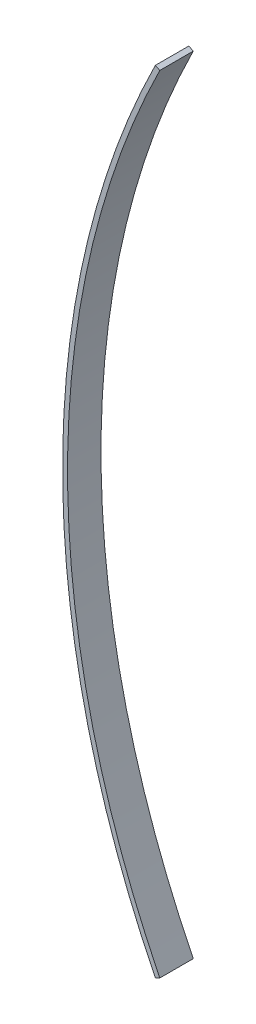
ISO-10303-21;
HEADER;
FILE_DESCRIPTION(('STEP AP214'),'2;1');
FILE_NAME('part.step','',(''),(''),'','','');
FILE_SCHEMA(('AUTOMOTIVE_DESIGN { 1 0 10303 214 1 1 1 1 }'));
ENDSEC;
DATA;
#1=APPLICATION_CONTEXT('core data for automotive mechanical design processes');
#2=APPLICATION_PROTOCOL_DEFINITION('international standard','automotive_design',2000,#1);
#3=PRODUCT_CONTEXT('',#1,'mechanical');
#4=PRODUCT('Part','Part','',(#3));
#5=PRODUCT_RELATED_PRODUCT_CATEGORY('part','',(#4));
#6=PRODUCT_DEFINITION_FORMATION('','',#4);
#7=PRODUCT_DEFINITION_CONTEXT('part definition',#1,'design');
#8=PRODUCT_DEFINITION('design','',#6,#7);
#9=PRODUCT_DEFINITION_SHAPE('','',#8);
#10=(LENGTH_UNIT() NAMED_UNIT(*) SI_UNIT(.MILLI.,.METRE.));
#11=(NAMED_UNIT(*) PLANE_ANGLE_UNIT() SI_UNIT($,.RADIAN.));
#12=(NAMED_UNIT(*) SI_UNIT($,.STERADIAN.) SOLID_ANGLE_UNIT());
#13=UNCERTAINTY_MEASURE_WITH_UNIT(LENGTH_MEASURE(1.E-05),#10,'distance_accuracy_value','');
#14=(GEOMETRIC_REPRESENTATION_CONTEXT(3) GLOBAL_UNCERTAINTY_ASSIGNED_CONTEXT((#13)) GLOBAL_UNIT_ASSIGNED_CONTEXT((#10,
#11,#12)) REPRESENTATION_CONTEXT('',''));
#15=CARTESIAN_POINT('',(0.,0.,0.));
#16=DIRECTION('',(0.,0.,1.));
#17=DIRECTION('',(1.,0.,0.));
#18=AXIS2_PLACEMENT_3D('',#15,#16,#17);
#19=CARTESIAN_POINT('',(178.25,84.268032686725,-6.75));
#20=DIRECTION('',(0.,0.,1.));
#21=DIRECTION('',(1.,0.,0.));
#22=AXIS2_PLACEMENT_3D('',#19,#20,#21);
#23=CYLINDRICAL_SURFACE('',#22,179.25);
#24=CARTESIAN_POINT('',(178.25,84.268032686725,0.));
#25=DIRECTION('',(0.,0.,1.));
#26=DIRECTION('',(1.,0.,0.));
#27=AXIS2_PLACEMENT_3D('',#24,#25,#26);
#28=CIRCLE('',#27,179.25);
#29=CARTESIAN_POINT('',(17.7180429539761,164.017974799391,0.));
#30=VERTEX_POINT('',#29);
#31=CARTESIAN_POINT('',(17.718042953978,4.51809057405543,0.));
#32=VERTEX_POINT('',#31);
#33=EDGE_CURVE('E108',#30,#32,#28,.T.);
#34=ORIENTED_EDGE('',*,*,#33,.F.);
#35=DIRECTION('',(0.,0.,1.));
#36=VECTOR('',#35,1.);
#37=CARTESIAN_POINT('',(17.7180429539761,164.017974799391,-6.75));
#38=LINE('',#37,#36);
#39=CARTESIAN_POINT('',(17.7180429539761,164.017974799391,-6.75));
#40=VERTEX_POINT('',#39);
#41=EDGE_CURVE('E11',#40,#30,#38,.T.);
#42=ORIENTED_EDGE('',*,*,#41,.F.);
#43=CARTESIAN_POINT('',(178.25,84.268032686725,-6.75));
#44=DIRECTION('',(0.,0.,1.));
#45=DIRECTION('',(1.,0.,0.));
#46=AXIS2_PLACEMENT_3D('',#43,#44,#45);
#47=CIRCLE('',#46,179.25);
#48=CARTESIAN_POINT('',(17.718042953978,4.51809057405543,-6.75));
#49=VERTEX_POINT('',#48);
#50=EDGE_CURVE('E103',#40,#49,#47,.T.);
#51=ORIENTED_EDGE('',*,*,#50,.T.);
#52=DIRECTION('',(0.,0.,1.));
#53=VECTOR('',#52,1.);
#54=CARTESIAN_POINT('',(17.718042953978,4.51809057405543,-6.75));
#55=LINE('',#54,#53);
#56=EDGE_CURVE('E46',#49,#32,#55,.T.);
#57=ORIENTED_EDGE('',*,*,#56,.T.);
#58=EDGE_LOOP('',(#34,#42,#51,#57));
#59=FACE_BOUND('',#58,.T.);
#60=ADVANCED_FACE('F43',(#59),#23,.T.);
#61=CARTESIAN_POINT('',(17.7180429539761,164.017974799391,-6.75));
#62=DIRECTION('',(-0.444909021549057,-0.895575771525928,0.));
#63=DIRECTION('',(0.895575771525928,-0.444909021549057,0.));
#64=AXIS2_PLACEMENT_3D('',#61,#62,#63);
#65=PLANE('',#64);
#66=DIRECTION('',(0.895575771525928,-0.444909021549057,0.));
#67=VECTOR('',#66,1.);
#68=CARTESIAN_POINT('',(17.7180429539761,164.017974799391,0.));
#69=LINE('',#68,#67);
#70=CARTESIAN_POINT('',(18.613618725502,163.573065777842,0.));
#71=VERTEX_POINT('',#70);
#72=EDGE_CURVE('E76',#30,#71,#69,.T.);
#73=ORIENTED_EDGE('',*,*,#72,.T.);
#74=DIRECTION('',(0.,0.,1.));
#75=VECTOR('',#74,1.);
#76=CARTESIAN_POINT('',(18.613618725502,163.573065777842,-6.75));
#77=LINE('',#76,#75);
#78=CARTESIAN_POINT('',(18.613618725502,163.573065777842,-6.75));
#79=VERTEX_POINT('',#78);
#80=EDGE_CURVE('E52',#79,#71,#77,.T.);
#81=ORIENTED_EDGE('',*,*,#80,.F.);
#82=DIRECTION('',(0.895575771525928,-0.444909021549057,0.));
#83=VECTOR('',#82,1.);
#84=CARTESIAN_POINT('',(17.7180429539761,164.017974799391,-6.75));
#85=LINE('',#84,#83);
#86=EDGE_CURVE('E91',#40,#79,#85,.T.);
#87=ORIENTED_EDGE('',*,*,#86,.F.);
#88=ORIENTED_EDGE('',*,*,#41,.T.);
#89=EDGE_LOOP('',(#73,#81,#87,#88));
#90=FACE_BOUND('',#89,.T.);
#91=ADVANCED_FACE('F118',(#90),#65,.F.);
#92=CARTESIAN_POINT('',(178.25,84.268032686725,-6.75));
#93=DIRECTION('',(0.,0.,1.));
#94=DIRECTION('',(1.,0.,0.));
#95=AXIS2_PLACEMENT_3D('',#92,#93,#94);
#96=CYLINDRICAL_SURFACE('',#95,178.25);
#97=CARTESIAN_POINT('',(178.25,84.268032686725,0.));
#98=DIRECTION('',(0.,0.,1.));
#99=DIRECTION('',(1.,0.,0.));
#100=AXIS2_PLACEMENT_3D('',#97,#98,#99);
#101=CIRCLE('',#100,178.25);
#102=CARTESIAN_POINT('',(18.6136187255039,4.96299959560449,0.));
#103=VERTEX_POINT('',#102);
#104=EDGE_CURVE('E98',#71,#103,#101,.T.);
#105=ORIENTED_EDGE('',*,*,#104,.T.);
#106=DIRECTION('',(0.,0.,1.));
#107=VECTOR('',#106,1.);
#108=CARTESIAN_POINT('',(18.6136187255039,4.96299959560449,-6.75));
#109=LINE('',#108,#107);
#110=CARTESIAN_POINT('',(18.6136187255039,4.96299959560449,-6.75));
#111=VERTEX_POINT('',#110);
#112=EDGE_CURVE('E95',#111,#103,#109,.T.);
#113=ORIENTED_EDGE('',*,*,#112,.F.);
#114=CARTESIAN_POINT('',(178.25,84.268032686725,-6.75));
#115=DIRECTION('',(0.,0.,1.));
#116=DIRECTION('',(1.,0.,0.));
#117=AXIS2_PLACEMENT_3D('',#114,#115,#116);
#118=CIRCLE('',#117,178.25);
#119=EDGE_CURVE('E88',#79,#111,#118,.T.);
#120=ORIENTED_EDGE('',*,*,#119,.F.);
#121=ORIENTED_EDGE('',*,*,#80,.T.);
#122=EDGE_LOOP('',(#105,#113,#120,#121));
#123=FACE_BOUND('',#122,.T.);
#124=ADVANCED_FACE('F96',(#123),#96,.F.);
#125=CARTESIAN_POINT('',(18.6136187255039,4.96299959560449,-6.75));
#126=DIRECTION('',(-0.444909021549057,0.895575771525928,0.));
#127=DIRECTION('',(-0.895575771525928,-0.444909021549057,0.));
#128=AXIS2_PLACEMENT_3D('',#125,#126,#127);
#129=PLANE('',#128);
#130=DIRECTION('',(-0.895575771525928,-0.444909021549057,0.));
#131=VECTOR('',#130,1.);
#132=CARTESIAN_POINT('',(18.6136187255039,4.96299959560449,0.));
#133=LINE('',#132,#131);
#134=EDGE_CURVE('E111',#103,#32,#133,.T.);
#135=ORIENTED_EDGE('',*,*,#134,.T.);
#136=ORIENTED_EDGE('',*,*,#56,.F.);
#137=DIRECTION('',(-0.895575771525928,-0.444909021549057,0.));
#138=VECTOR('',#137,1.);
#139=CARTESIAN_POINT('',(18.6136187255039,4.96299959560449,-6.75));
#140=LINE('',#139,#138);
#141=EDGE_CURVE('E85',#111,#49,#140,.T.);
#142=ORIENTED_EDGE('',*,*,#141,.F.);
#143=ORIENTED_EDGE('',*,*,#112,.T.);
#144=EDGE_LOOP('',(#135,#136,#142,#143));
#145=FACE_BOUND('',#144,.T.);
#146=ADVANCED_FACE('F102',(#145),#129,.F.);
#147=CARTESIAN_POINT('',(178.25,84.268032686725,-6.75));
#148=DIRECTION('',(0.,0.,1.));
#149=DIRECTION('',(1.,0.,0.));
#150=AXIS2_PLACEMENT_3D('',#147,#148,#149);
#151=PLANE('',#150);
#152=ORIENTED_EDGE('',*,*,#50,.F.);
#153=ORIENTED_EDGE('',*,*,#86,.T.);
#154=ORIENTED_EDGE('',*,*,#119,.T.);
#155=ORIENTED_EDGE('',*,*,#141,.T.);
#156=EDGE_LOOP('',(#152,#153,#154,#155));
#157=FACE_BOUND('',#156,.T.);
#158=ADVANCED_FACE('F90',(#157),#151,.F.);
#159=CARTESIAN_POINT('',(178.25,84.268032686725,0.));
#160=DIRECTION('',(0.,0.,1.));
#161=DIRECTION('',(1.,0.,0.));
#162=AXIS2_PLACEMENT_3D('',#159,#160,#161);
#163=PLANE('',#162);
#164=ORIENTED_EDGE('',*,*,#33,.T.);
#165=ORIENTED_EDGE('',*,*,#134,.F.);
#166=ORIENTED_EDGE('',*,*,#104,.F.);
#167=ORIENTED_EDGE('',*,*,#72,.F.);
#168=EDGE_LOOP('',(#164,#165,#166,#167));
#169=FACE_BOUND('',#168,.T.);
#170=ADVANCED_FACE('F116',(#169),#163,.T.);
#171=CLOSED_SHELL('',(#60,#91,#124,#146,#158,#170));
#172=MANIFOLD_SOLID_BREP('B2',#171);
#173=ADVANCED_BREP_SHAPE_REPRESENTATION('',(#18,#172),#14);
#174=SHAPE_DEFINITION_REPRESENTATION(#9,#173);
ENDSEC;
END-ISO-10303-21;
